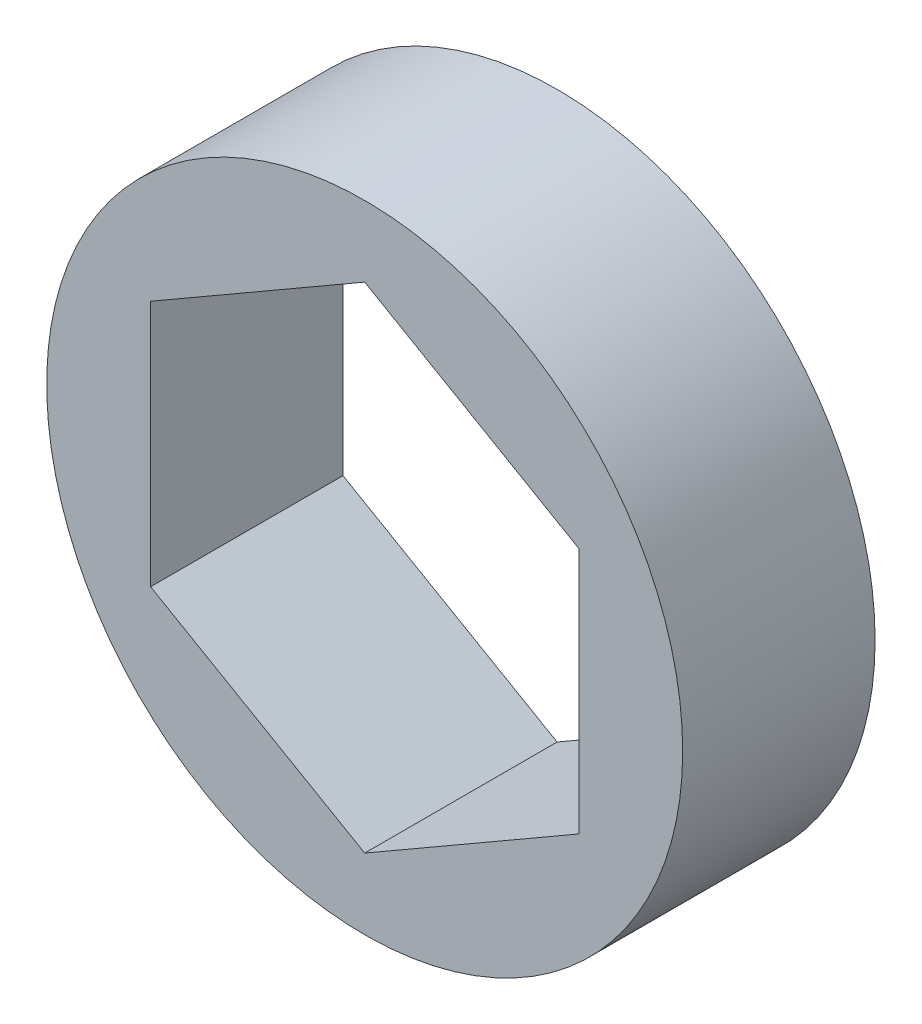
ISO-10303-21;
HEADER;
FILE_DESCRIPTION(('STEP AP214'),'2;1');
FILE_NAME('part.step','',(''),(''),'','','');
FILE_SCHEMA(('AUTOMOTIVE_DESIGN { 1 0 10303 214 1 1 1 1 }'));
ENDSEC;
DATA;
#1=APPLICATION_CONTEXT('core data for automotive mechanical design processes');
#2=APPLICATION_PROTOCOL_DEFINITION('international standard','automotive_design',2000,#1);
#3=PRODUCT_CONTEXT('',#1,'mechanical');
#4=PRODUCT('Part','Part','',(#3));
#5=PRODUCT_RELATED_PRODUCT_CATEGORY('part','',(#4));
#6=PRODUCT_DEFINITION_FORMATION('','',#4);
#7=PRODUCT_DEFINITION_CONTEXT('part definition',#1,'design');
#8=PRODUCT_DEFINITION('design','',#6,#7);
#9=PRODUCT_DEFINITION_SHAPE('','',#8);
#10=(LENGTH_UNIT() NAMED_UNIT(*) SI_UNIT(.MILLI.,.METRE.));
#11=(NAMED_UNIT(*) PLANE_ANGLE_UNIT() SI_UNIT($,.RADIAN.));
#12=(NAMED_UNIT(*) SI_UNIT($,.STERADIAN.) SOLID_ANGLE_UNIT());
#13=UNCERTAINTY_MEASURE_WITH_UNIT(LENGTH_MEASURE(1.E-05),#10,'distance_accuracy_value','');
#14=(GEOMETRIC_REPRESENTATION_CONTEXT(3) GLOBAL_UNCERTAINTY_ASSIGNED_CONTEXT((#13)) GLOBAL_UNIT_ASSIGNED_CONTEXT((#10,
#11,#12)) REPRESENTATION_CONTEXT('',''));
#15=CARTESIAN_POINT('',(0.,0.,0.));
#16=DIRECTION('',(0.,0.,1.));
#17=DIRECTION('',(1.,0.,0.));
#18=AXIS2_PLACEMENT_3D('',#15,#16,#17);
#19=CARTESIAN_POINT('',(0.,0.,2.88163));
#20=DIRECTION('',(0.,0.,1.));
#21=DIRECTION('',(1.,0.,0.));
#22=AXIS2_PLACEMENT_3D('',#19,#20,#21);
#23=PLANE('',#22);
#24=CARTESIAN_POINT('',(0.,0.,2.88163));
#25=DIRECTION('',(0.,0.,1.));
#26=DIRECTION('',(1.,0.,0.));
#27=AXIS2_PLACEMENT_3D('',#24,#25,#26);
#28=CIRCLE('',#27,9.525);
#29=CARTESIAN_POINT('',(9.525,0.,2.88163));
#30=VERTEX_POINT('',#29);
#31=EDGE_CURVE('E11',#30,#30,#28,.T.);
#32=ORIENTED_EDGE('',*,*,#31,.T.);
#33=EDGE_LOOP('',(#32));
#34=FACE_BOUND('',#33,.T.);
#35=DIRECTION('',(-0.866025403784439,-0.5,0.));
#36=VECTOR('',#35,1.);
#37=CARTESIAN_POINT('',(0.,7.40567190289533,2.88163));
#38=LINE('',#37,#36);
#39=CARTESIAN_POINT('',(0.,7.40567190289533,2.88163));
#40=VERTEX_POINT('',#39);
#41=CARTESIAN_POINT('',(-6.4135,3.70283595144767,2.88163));
#42=VERTEX_POINT('',#41);
#43=EDGE_CURVE('E108',#40,#42,#38,.T.);
#44=ORIENTED_EDGE('',*,*,#43,.F.);
#45=DIRECTION('',(-0.866025403784439,0.5,0.));
#46=VECTOR('',#45,1.);
#47=CARTESIAN_POINT('',(6.4135,3.70283595144767,2.88163));
#48=LINE('',#47,#46);
#49=CARTESIAN_POINT('',(6.4135,3.70283595144767,2.88163));
#50=VERTEX_POINT('',#49);
#51=EDGE_CURVE('E99',#50,#40,#48,.T.);
#52=ORIENTED_EDGE('',*,*,#51,.F.);
#53=DIRECTION('',(0.,1.,0.));
#54=VECTOR('',#53,1.);
#55=CARTESIAN_POINT('',(6.4135,-3.70283595144767,2.88163));
#56=LINE('',#55,#54);
#57=CARTESIAN_POINT('',(6.4135,-3.70283595144767,2.88163));
#58=VERTEX_POINT('',#57);
#59=EDGE_CURVE('E133',#58,#50,#56,.T.);
#60=ORIENTED_EDGE('',*,*,#59,.F.);
#61=DIRECTION('',(0.866025403784439,0.5,0.));
#62=VECTOR('',#61,1.);
#63=CARTESIAN_POINT('',(0.,-7.40567190289533,2.88163));
#64=LINE('',#63,#62);
#65=CARTESIAN_POINT('',(0.,-7.40567190289533,2.88163));
#66=VERTEX_POINT('',#65);
#67=EDGE_CURVE('E130',#66,#58,#64,.T.);
#68=ORIENTED_EDGE('',*,*,#67,.F.);
#69=DIRECTION('',(0.866025403784439,-0.5,0.));
#70=VECTOR('',#69,1.);
#71=CARTESIAN_POINT('',(-6.4135,-3.70283595144767,2.88163));
#72=LINE('',#71,#70);
#73=CARTESIAN_POINT('',(-6.4135,-3.70283595144767,2.88163));
#74=VERTEX_POINT('',#73);
#75=EDGE_CURVE('E125',#74,#66,#72,.T.);
#76=ORIENTED_EDGE('',*,*,#75,.F.);
#77=DIRECTION('',(0.,-1.,0.));
#78=VECTOR('',#77,1.);
#79=CARTESIAN_POINT('',(-6.4135,3.70283595144767,2.88163));
#80=LINE('',#79,#78);
#81=EDGE_CURVE('E121',#42,#74,#80,.T.);
#82=ORIENTED_EDGE('',*,*,#81,.F.);
#83=EDGE_LOOP('',(#44,#52,#60,#68,#76,#82));
#84=FACE_BOUND('',#83,.T.);
#85=ADVANCED_FACE('F45',(#34,#84),#23,.T.);
#86=CARTESIAN_POINT('',(0.,0.,-2.88163));
#87=DIRECTION('',(0.,0.,1.));
#88=DIRECTION('',(1.,0.,0.));
#89=AXIS2_PLACEMENT_3D('',#86,#87,#88);
#90=PLANE('',#89);
#91=CARTESIAN_POINT('',(0.,0.,-2.88163));
#92=DIRECTION('',(0.,0.,1.));
#93=DIRECTION('',(1.,0.,0.));
#94=AXIS2_PLACEMENT_3D('',#91,#92,#93);
#95=CIRCLE('',#94,9.525);
#96=CARTESIAN_POINT('',(9.525,0.,-2.88163));
#97=VERTEX_POINT('',#96);
#98=EDGE_CURVE('E49',#97,#97,#95,.T.);
#99=ORIENTED_EDGE('',*,*,#98,.F.);
#100=EDGE_LOOP('',(#99));
#101=FACE_BOUND('',#100,.T.);
#102=DIRECTION('',(-0.866025403784439,0.5,0.));
#103=VECTOR('',#102,1.);
#104=CARTESIAN_POINT('',(6.4135,3.70283595144767,-2.88163));
#105=LINE('',#104,#103);
#106=CARTESIAN_POINT('',(6.4135,3.70283595144767,-2.88163));
#107=VERTEX_POINT('',#106);
#108=CARTESIAN_POINT('',(0.,7.40567190289533,-2.88163));
#109=VERTEX_POINT('',#108);
#110=EDGE_CURVE('E69',#107,#109,#105,.T.);
#111=ORIENTED_EDGE('',*,*,#110,.T.);
#112=DIRECTION('',(-0.866025403784439,-0.5,0.));
#113=VECTOR('',#112,1.);
#114=CARTESIAN_POINT('',(0.,7.40567190289533,-2.88163));
#115=LINE('',#114,#113);
#116=CARTESIAN_POINT('',(-6.4135,3.70283595144767,-2.88163));
#117=VERTEX_POINT('',#116);
#118=EDGE_CURVE('E115',#109,#117,#115,.T.);
#119=ORIENTED_EDGE('',*,*,#118,.T.);
#120=DIRECTION('',(0.,-1.,0.));
#121=VECTOR('',#120,1.);
#122=CARTESIAN_POINT('',(-6.4135,3.70283595144767,-2.88163));
#123=LINE('',#122,#121);
#124=CARTESIAN_POINT('',(-6.4135,-3.70283595144767,-2.88163));
#125=VERTEX_POINT('',#124);
#126=EDGE_CURVE('E140',#117,#125,#123,.T.);
#127=ORIENTED_EDGE('',*,*,#126,.T.);
#128=DIRECTION('',(0.866025403784439,-0.5,0.));
#129=VECTOR('',#128,1.);
#130=CARTESIAN_POINT('',(-6.4135,-3.70283595144767,-2.88163));
#131=LINE('',#130,#129);
#132=CARTESIAN_POINT('',(0.,-7.40567190289533,-2.88163));
#133=VERTEX_POINT('',#132);
#134=EDGE_CURVE('E144',#125,#133,#131,.T.);
#135=ORIENTED_EDGE('',*,*,#134,.T.);
#136=DIRECTION('',(0.866025403784439,0.5,0.));
#137=VECTOR('',#136,1.);
#138=CARTESIAN_POINT('',(0.,-7.40567190289533,-2.88163));
#139=LINE('',#138,#137);
#140=CARTESIAN_POINT('',(6.4135,-3.70283595144767,-2.88163));
#141=VERTEX_POINT('',#140);
#142=EDGE_CURVE('E148',#133,#141,#139,.T.);
#143=ORIENTED_EDGE('',*,*,#142,.T.);
#144=DIRECTION('',(0.,1.,0.));
#145=VECTOR('',#144,1.);
#146=CARTESIAN_POINT('',(6.4135,-3.70283595144767,-2.88163));
#147=LINE('',#146,#145);
#148=EDGE_CURVE('E109',#141,#107,#147,.T.);
#149=ORIENTED_EDGE('',*,*,#148,.T.);
#150=EDGE_LOOP('',(#111,#119,#127,#135,#143,#149));
#151=FACE_BOUND('',#150,.T.);
#152=ADVANCED_FACE('F172',(#101,#151),#90,.F.);
#153=CARTESIAN_POINT('',(0.,0.,2.88163));
#154=DIRECTION('',(0.,0.,-1.));
#155=DIRECTION('',(-1.,0.,0.));
#156=AXIS2_PLACEMENT_3D('',#153,#154,#155);
#157=CYLINDRICAL_SURFACE('',#156,9.525);
#158=ORIENTED_EDGE('',*,*,#31,.F.);
#159=EDGE_LOOP('',(#158));
#160=FACE_BOUND('',#159,.T.);
#161=ORIENTED_EDGE('',*,*,#98,.T.);
#162=EDGE_LOOP('',(#161));
#163=FACE_BOUND('',#162,.T.);
#164=ADVANCED_FACE('F47',(#160,#163),#157,.T.);
#165=CARTESIAN_POINT('',(6.4135,3.70283595144767,2.88163));
#166=DIRECTION('',(-0.5,-0.866025403784439,0.));
#167=DIRECTION('',(0.866025403784439,-0.5,0.));
#168=AXIS2_PLACEMENT_3D('',#165,#166,#167);
#169=PLANE('',#168);
#170=ORIENTED_EDGE('',*,*,#110,.F.);
#171=DIRECTION('',(0.,0.,-1.));
#172=VECTOR('',#171,1.);
#173=CARTESIAN_POINT('',(6.4135,3.70283595144767,2.88163));
#174=LINE('',#173,#172);
#175=EDGE_CURVE('E103',#50,#107,#174,.T.);
#176=ORIENTED_EDGE('',*,*,#175,.F.);
#177=ORIENTED_EDGE('',*,*,#51,.T.);
#178=DIRECTION('',(0.,0.,-1.));
#179=VECTOR('',#178,1.);
#180=CARTESIAN_POINT('',(0.,7.40567190289533,2.88163));
#181=LINE('',#180,#179);
#182=EDGE_CURVE('E102',#40,#109,#181,.T.);
#183=ORIENTED_EDGE('',*,*,#182,.T.);
#184=EDGE_LOOP('',(#170,#176,#177,#183));
#185=FACE_BOUND('',#184,.T.);
#186=ADVANCED_FACE('F101',(#185),#169,.T.);
#187=CARTESIAN_POINT('',(0.,7.40567190289533,2.88163));
#188=DIRECTION('',(0.5,-0.866025403784439,0.));
#189=DIRECTION('',(0.866025403784439,0.5,0.));
#190=AXIS2_PLACEMENT_3D('',#187,#188,#189);
#191=PLANE('',#190);
#192=ORIENTED_EDGE('',*,*,#118,.F.);
#193=ORIENTED_EDGE('',*,*,#182,.F.);
#194=ORIENTED_EDGE('',*,*,#43,.T.);
#195=DIRECTION('',(0.,0.,-1.));
#196=VECTOR('',#195,1.);
#197=CARTESIAN_POINT('',(-6.4135,3.70283595144767,2.88163));
#198=LINE('',#197,#196);
#199=EDGE_CURVE('E117',#42,#117,#198,.T.);
#200=ORIENTED_EDGE('',*,*,#199,.T.);
#201=EDGE_LOOP('',(#192,#193,#194,#200));
#202=FACE_BOUND('',#201,.T.);
#203=ADVANCED_FACE('F112',(#202),#191,.T.);
#204=CARTESIAN_POINT('',(-6.4135,3.70283595144767,2.88163));
#205=DIRECTION('',(1.,0.,0.));
#206=DIRECTION('',(0.,1.,0.));
#207=AXIS2_PLACEMENT_3D('',#204,#205,#206);
#208=PLANE('',#207);
#209=ORIENTED_EDGE('',*,*,#126,.F.);
#210=ORIENTED_EDGE('',*,*,#199,.F.);
#211=ORIENTED_EDGE('',*,*,#81,.T.);
#212=DIRECTION('',(0.,0.,-1.));
#213=VECTOR('',#212,1.);
#214=CARTESIAN_POINT('',(-6.4135,-3.70283595144767,2.88163));
#215=LINE('',#214,#213);
#216=EDGE_CURVE('E162',#74,#125,#215,.T.);
#217=ORIENTED_EDGE('',*,*,#216,.T.);
#218=EDGE_LOOP('',(#209,#210,#211,#217));
#219=FACE_BOUND('',#218,.T.);
#220=ADVANCED_FACE('F168',(#219),#208,.T.);
#221=CARTESIAN_POINT('',(-6.4135,-3.70283595144767,2.88163));
#222=DIRECTION('',(0.5,0.866025403784439,0.));
#223=DIRECTION('',(-0.866025403784439,0.5,0.));
#224=AXIS2_PLACEMENT_3D('',#221,#222,#223);
#225=PLANE('',#224);
#226=ORIENTED_EDGE('',*,*,#134,.F.);
#227=ORIENTED_EDGE('',*,*,#216,.F.);
#228=ORIENTED_EDGE('',*,*,#75,.T.);
#229=DIRECTION('',(0.,0.,-1.));
#230=VECTOR('',#229,1.);
#231=CARTESIAN_POINT('',(0.,-7.40567190289533,2.88163));
#232=LINE('',#231,#230);
#233=EDGE_CURVE('E159',#66,#133,#232,.T.);
#234=ORIENTED_EDGE('',*,*,#233,.T.);
#235=EDGE_LOOP('',(#226,#227,#228,#234));
#236=FACE_BOUND('',#235,.T.);
#237=ADVANCED_FACE('F180',(#236),#225,.T.);
#238=CARTESIAN_POINT('',(0.,-7.40567190289533,2.88163));
#239=DIRECTION('',(-0.5,0.866025403784439,0.));
#240=DIRECTION('',(-0.866025403784439,-0.5,0.));
#241=AXIS2_PLACEMENT_3D('',#238,#239,#240);
#242=PLANE('',#241);
#243=ORIENTED_EDGE('',*,*,#142,.F.);
#244=ORIENTED_EDGE('',*,*,#233,.F.);
#245=ORIENTED_EDGE('',*,*,#67,.T.);
#246=DIRECTION('',(0.,0.,-1.));
#247=VECTOR('',#246,1.);
#248=CARTESIAN_POINT('',(6.4135,-3.70283595144767,2.88163));
#249=LINE('',#248,#247);
#250=EDGE_CURVE('E61',#58,#141,#249,.T.);
#251=ORIENTED_EDGE('',*,*,#250,.T.);
#252=EDGE_LOOP('',(#243,#244,#245,#251));
#253=FACE_BOUND('',#252,.T.);
#254=ADVANCED_FACE('F178',(#253),#242,.T.);
#255=CARTESIAN_POINT('',(6.4135,-3.70283595144767,2.88163));
#256=DIRECTION('',(-1.,0.,0.));
#257=DIRECTION('',(0.,-1.,0.));
#258=AXIS2_PLACEMENT_3D('',#255,#256,#257);
#259=PLANE('',#258);
#260=ORIENTED_EDGE('',*,*,#148,.F.);
#261=ORIENTED_EDGE('',*,*,#250,.F.);
#262=ORIENTED_EDGE('',*,*,#59,.T.);
#263=ORIENTED_EDGE('',*,*,#175,.T.);
#264=EDGE_LOOP('',(#260,#261,#262,#263));
#265=FACE_BOUND('',#264,.T.);
#266=ADVANCED_FACE('F174',(#265),#259,.T.);
#267=CLOSED_SHELL('',(#85,#152,#164,#186,#203,#220,#237,#254,#266));
#268=MANIFOLD_SOLID_BREP('B2',#267);
#269=ADVANCED_BREP_SHAPE_REPRESENTATION('',(#18,#268),#14);
#270=SHAPE_DEFINITION_REPRESENTATION(#9,#269);
ENDSEC;
END-ISO-10303-21;
